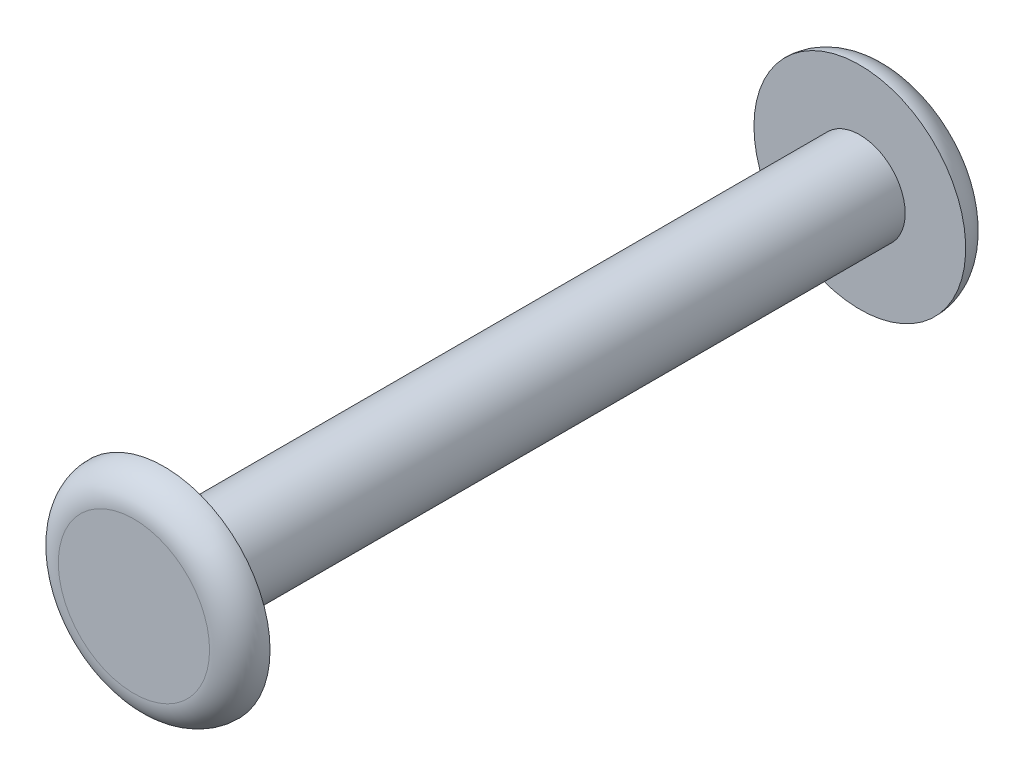
ISO-10303-21;
HEADER;
FILE_DESCRIPTION(('STEP AP214'),'2;1');
FILE_NAME('part.step','',(''),(''),'','','');
FILE_SCHEMA(('AUTOMOTIVE_DESIGN { 1 0 10303 214 1 1 1 1 }'));
ENDSEC;
DATA;
#1=APPLICATION_CONTEXT('core data for automotive mechanical design processes');
#2=APPLICATION_PROTOCOL_DEFINITION('international standard','automotive_design',2000,#1);
#3=PRODUCT_CONTEXT('',#1,'mechanical');
#4=PRODUCT('Part','Part','',(#3));
#5=PRODUCT_RELATED_PRODUCT_CATEGORY('part','',(#4));
#6=PRODUCT_DEFINITION_FORMATION('','',#4);
#7=PRODUCT_DEFINITION_CONTEXT('part definition',#1,'design');
#8=PRODUCT_DEFINITION('design','',#6,#7);
#9=PRODUCT_DEFINITION_SHAPE('','',#8);
#10=(LENGTH_UNIT() NAMED_UNIT(*) SI_UNIT(.MILLI.,.METRE.));
#11=(NAMED_UNIT(*) PLANE_ANGLE_UNIT() SI_UNIT($,.RADIAN.));
#12=(NAMED_UNIT(*) SI_UNIT($,.STERADIAN.) SOLID_ANGLE_UNIT());
#13=UNCERTAINTY_MEASURE_WITH_UNIT(LENGTH_MEASURE(1.E-05),#10,'distance_accuracy_value','');
#14=(GEOMETRIC_REPRESENTATION_CONTEXT(3) GLOBAL_UNCERTAINTY_ASSIGNED_CONTEXT((#13)) GLOBAL_UNIT_ASSIGNED_CONTEXT((#10,
#11,#12)) REPRESENTATION_CONTEXT('',''));
#15=CARTESIAN_POINT('',(0.,0.,0.));
#16=DIRECTION('',(0.,0.,1.));
#17=DIRECTION('',(1.,0.,0.));
#18=AXIS2_PLACEMENT_3D('',#15,#16,#17);
#19=CARTESIAN_POINT('',(0.,0.,28.75));
#20=DIRECTION('',(0.,0.,-1.));
#21=DIRECTION('',(-1.,0.,0.));
#22=AXIS2_PLACEMENT_3D('',#19,#20,#21);
#23=CYLINDRICAL_SURFACE('',#22,3.75);
#24=CARTESIAN_POINT('',(0.,0.,28.75));
#25=DIRECTION('',(0.,0.,1.));
#26=DIRECTION('',(1.,0.,0.));
#27=AXIS2_PLACEMENT_3D('',#24,#25,#26);
#28=CIRCLE('',#27,3.75);
#29=CARTESIAN_POINT('',(3.75,0.,28.75));
#30=VERTEX_POINT('',#29);
#31=EDGE_CURVE('E52',#30,#30,#28,.T.);
#32=ORIENTED_EDGE('',*,*,#31,.F.);
#33=EDGE_LOOP('',(#32));
#34=FACE_BOUND('',#33,.T.);
#35=CARTESIAN_POINT('',(0.,0.,-28.75));
#36=DIRECTION('',(0.,0.,1.));
#37=DIRECTION('',(1.,0.,0.));
#38=AXIS2_PLACEMENT_3D('',#35,#36,#37);
#39=CIRCLE('',#38,3.75);
#40=CARTESIAN_POINT('',(3.75,0.,-28.75));
#41=VERTEX_POINT('',#40);
#42=EDGE_CURVE('E60',#41,#41,#39,.T.);
#43=ORIENTED_EDGE('',*,*,#42,.T.);
#44=EDGE_LOOP('',(#43));
#45=FACE_BOUND('',#44,.T.);
#46=ADVANCED_FACE('F39',(#34,#45),#23,.T.);
#47=CARTESIAN_POINT('',(0.,0.,31.25));
#48=DIRECTION('',(0.,0.,1.));
#49=DIRECTION('',(1.,0.,0.));
#50=AXIS2_PLACEMENT_3D('',#47,#48,#49);
#51=PLANE('',#50);
#52=CARTESIAN_POINT('',(0.,0.,31.25));
#53=DIRECTION('',(0.,0.,1.));
#54=DIRECTION('',(1.,0.,0.));
#55=AXIS2_PLACEMENT_3D('',#52,#53,#54);
#56=CIRCLE('',#55,6.25);
#57=CARTESIAN_POINT('',(6.25,0.,31.25));
#58=VERTEX_POINT('',#57);
#59=EDGE_CURVE('E10',#58,#58,#56,.T.);
#60=ORIENTED_EDGE('',*,*,#59,.T.);
#61=EDGE_LOOP('',(#60));
#62=FACE_BOUND('',#61,.T.);
#63=ADVANCED_FACE('F89',(#62),#51,.T.);
#64=CARTESIAN_POINT('',(0.,0.,28.75));
#65=DIRECTION('',(0.,0.,1.));
#66=DIRECTION('',(1.,0.,0.));
#67=AXIS2_PLACEMENT_3D('',#64,#65,#66);
#68=PLANE('',#67);
#69=ORIENTED_EDGE('',*,*,#31,.T.);
#70=EDGE_LOOP('',(#69));
#71=FACE_BOUND('',#70,.T.);
#72=CARTESIAN_POINT('',(0.,0.,28.75));
#73=DIRECTION('',(0.,0.,1.));
#74=DIRECTION('',(1.,0.,0.));
#75=AXIS2_PLACEMENT_3D('',#72,#73,#74);
#76=CIRCLE('',#75,8.75);
#77=CARTESIAN_POINT('',(8.75,0.,28.75));
#78=VERTEX_POINT('',#77);
#79=EDGE_CURVE('E57',#78,#78,#76,.T.);
#80=ORIENTED_EDGE('',*,*,#79,.F.);
#81=EDGE_LOOP('',(#80));
#82=FACE_BOUND('',#81,.T.);
#83=ADVANCED_FACE('F84',(#71,#82),#68,.F.);
#84=CARTESIAN_POINT('',(0.,0.,-31.25));
#85=DIRECTION('',(0.,0.,-1.));
#86=DIRECTION('',(-1.,0.,0.));
#87=AXIS2_PLACEMENT_3D('',#84,#85,#86);
#88=PLANE('',#87);
#89=CARTESIAN_POINT('',(0.,0.,-31.25));
#90=DIRECTION('',(0.,0.,-1.));
#91=DIRECTION('',(-1.,0.,0.));
#92=AXIS2_PLACEMENT_3D('',#89,#90,#91);
#93=CIRCLE('',#92,6.25);
#94=CARTESIAN_POINT('',(-6.25,0.,-31.25));
#95=VERTEX_POINT('',#94);
#96=EDGE_CURVE('E47',#95,#95,#93,.T.);
#97=ORIENTED_EDGE('',*,*,#96,.T.);
#98=EDGE_LOOP('',(#97));
#99=FACE_BOUND('',#98,.T.);
#100=ADVANCED_FACE('F77',(#99),#88,.T.);
#101=CARTESIAN_POINT('',(0.,0.,-28.75));
#102=DIRECTION('',(0.,0.,-1.));
#103=DIRECTION('',(-1.,0.,0.));
#104=AXIS2_PLACEMENT_3D('',#101,#102,#103);
#105=PLANE('',#104);
#106=ORIENTED_EDGE('',*,*,#42,.F.);
#107=EDGE_LOOP('',(#106));
#108=FACE_BOUND('',#107,.T.);
#109=CARTESIAN_POINT('',(0.,0.,-28.75));
#110=DIRECTION('',(0.,0.,-1.));
#111=DIRECTION('',(-1.,0.,0.));
#112=AXIS2_PLACEMENT_3D('',#109,#110,#111);
#113=CIRCLE('',#112,8.75);
#114=CARTESIAN_POINT('',(-8.75,0.,-28.75));
#115=VERTEX_POINT('',#114);
#116=EDGE_CURVE('E63',#115,#115,#113,.T.);
#117=ORIENTED_EDGE('',*,*,#116,.F.);
#118=EDGE_LOOP('',(#117));
#119=FACE_BOUND('',#118,.T.);
#120=ADVANCED_FACE('F75',(#108,#119),#105,.F.);
#121=CARTESIAN_POINT('',(0.,0.,-28.75));
#122=DIRECTION('',(0.,0.,-1.));
#123=DIRECTION('',(-1.,0.,0.));
#124=AXIS2_PLACEMENT_3D('',#121,#122,#123);
#125=TOROIDAL_SURFACE('',#124,6.25,2.5);
#126=ORIENTED_EDGE('',*,*,#116,.T.);
#127=EDGE_LOOP('',(#126));
#128=FACE_BOUND('',#127,.T.);
#129=ORIENTED_EDGE('',*,*,#96,.F.);
#130=EDGE_LOOP('',(#129));
#131=FACE_BOUND('',#130,.T.);
#132=ADVANCED_FACE('F72',(#128,#131),#125,.T.);
#133=CARTESIAN_POINT('',(0.,0.,28.75));
#134=DIRECTION('',(0.,0.,1.));
#135=DIRECTION('',(1.,0.,0.));
#136=AXIS2_PLACEMENT_3D('',#133,#134,#135);
#137=TOROIDAL_SURFACE('',#136,6.25,2.5);
#138=ORIENTED_EDGE('',*,*,#79,.T.);
#139=EDGE_LOOP('',(#138));
#140=FACE_BOUND('',#139,.T.);
#141=ORIENTED_EDGE('',*,*,#59,.F.);
#142=EDGE_LOOP('',(#141));
#143=FACE_BOUND('',#142,.T.);
#144=ADVANCED_FACE('F41',(#140,#143),#137,.T.);
#145=CLOSED_SHELL('',(#46,#63,#83,#100,#120,#132,#144));
#146=MANIFOLD_SOLID_BREP('B2',#145);
#147=ADVANCED_BREP_SHAPE_REPRESENTATION('',(#18,#146),#14);
#148=SHAPE_DEFINITION_REPRESENTATION(#9,#147);
ENDSEC;
END-ISO-10303-21;
